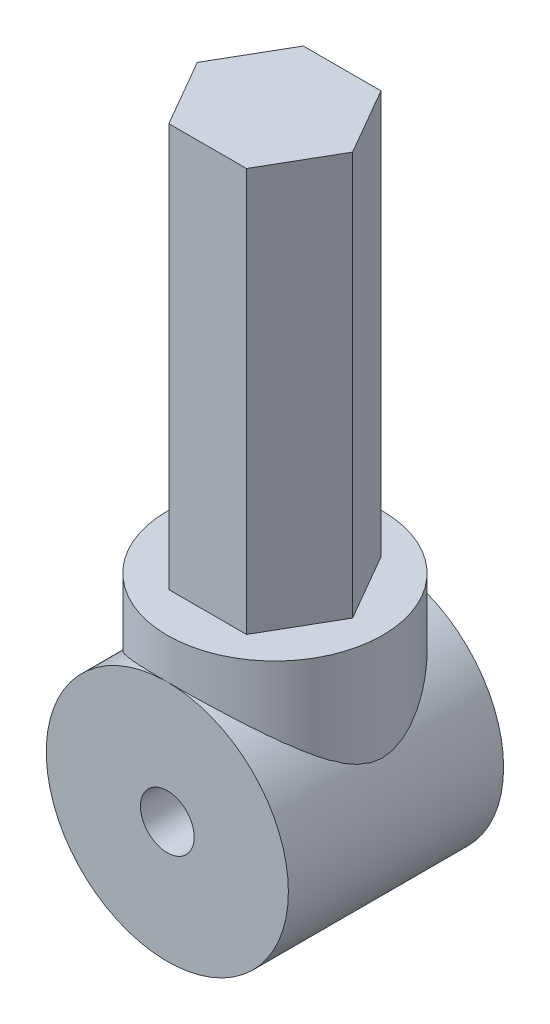
ISO-10303-21;
HEADER;
FILE_DESCRIPTION(('STEP AP214'),'2;1');
FILE_NAME('part.step','',(''),(''),'','','');
FILE_SCHEMA(('AUTOMOTIVE_DESIGN { 1 0 10303 214 1 1 1 1 }'));
ENDSEC;
DATA;
#1=APPLICATION_CONTEXT('core data for automotive mechanical design processes');
#2=APPLICATION_PROTOCOL_DEFINITION('international standard','automotive_design',2000,#1);
#3=PRODUCT_CONTEXT('',#1,'mechanical');
#4=PRODUCT('Part','Part','',(#3));
#5=PRODUCT_RELATED_PRODUCT_CATEGORY('part','',(#4));
#6=PRODUCT_DEFINITION_FORMATION('','',#4);
#7=PRODUCT_DEFINITION_CONTEXT('part definition',#1,'design');
#8=PRODUCT_DEFINITION('design','',#6,#7);
#9=PRODUCT_DEFINITION_SHAPE('','',#8);
#10=(LENGTH_UNIT() NAMED_UNIT(*) SI_UNIT(.MILLI.,.METRE.));
#11=(NAMED_UNIT(*) PLANE_ANGLE_UNIT() SI_UNIT($,.RADIAN.));
#12=(NAMED_UNIT(*) SI_UNIT($,.STERADIAN.) SOLID_ANGLE_UNIT());
#13=UNCERTAINTY_MEASURE_WITH_UNIT(LENGTH_MEASURE(1.E-05),#10,'distance_accuracy_value','');
#14=(GEOMETRIC_REPRESENTATION_CONTEXT(3) GLOBAL_UNCERTAINTY_ASSIGNED_CONTEXT((#13)) GLOBAL_UNIT_ASSIGNED_CONTEXT((#10,
#11,#12)) REPRESENTATION_CONTEXT('',''));
#15=CARTESIAN_POINT('',(0.,0.,0.));
#16=DIRECTION('',(0.,0.,1.));
#17=DIRECTION('',(1.,0.,0.));
#18=AXIS2_PLACEMENT_3D('',#15,#16,#17);
#19=CARTESIAN_POINT('',(0.,30.,20.));
#20=DIRECTION('',(0.,-1.,0.));
#21=DIRECTION('',(0.,0.,-1.));
#22=AXIS2_PLACEMENT_3D('',#19,#20,#21);
#23=CYLINDRICAL_SURFACE('',#22,20.);
#24=CARTESIAN_POINT('',(0.,30.,20.));
#25=DIRECTION('',(0.,1.,0.));
#26=DIRECTION('',(0.,0.,1.));
#27=AXIS2_PLACEMENT_3D('',#24,#25,#26);
#28=CIRCLE('',#27,20.);
#29=CARTESIAN_POINT('',(0.,30.,40.));
#30=VERTEX_POINT('',#29);
#31=EDGE_CURVE('E12',#30,#30,#28,.T.);
#32=ORIENTED_EDGE('',*,*,#31,.F.);
#33=EDGE_LOOP('',(#32));
#34=FACE_BOUND('',#33,.T.);
#35=CARTESIAN_POINT('',(0.,5.,20.));
#36=DIRECTION('',(0.,1.,0.));
#37=DIRECTION('',(0.,0.,1.));
#38=AXIS2_PLACEMENT_3D('',#35,#36,#37);
#39=CIRCLE('',#38,20.);
#40=CARTESIAN_POINT('',(0.,5.,40.));
#41=VERTEX_POINT('',#40);
#42=EDGE_CURVE('E58',#41,#41,#39,.T.);
#43=ORIENTED_EDGE('',*,*,#42,.T.);
#44=EDGE_LOOP('',(#43));
#45=FACE_BOUND('',#44,.T.);
#46=ADVANCED_FACE('F55',(#34,#45),#23,.T.);
#47=CARTESIAN_POINT('',(0.,30.,0.));
#48=DIRECTION('',(0.,1.,0.));
#49=DIRECTION('',(0.,0.,1.));
#50=AXIS2_PLACEMENT_3D('',#47,#48,#49);
#51=PLANE('',#50);
#52=DIRECTION('',(0.5,0.,-0.866025403784439));
#53=VECTOR('',#52,1.);
#54=CARTESIAN_POINT('',(19.4855715851499,30.,11.25));
#55=LINE('',#54,#53);
#56=CARTESIAN_POINT('',(7.21687836487033,30.,32.5));
#57=VERTEX_POINT('',#56);
#58=CARTESIAN_POINT('',(14.4337567297407,30.,20.));
#59=VERTEX_POINT('',#58);
#60=EDGE_CURVE('E70',#57,#59,#55,.T.);
#61=ORIENTED_EDGE('',*,*,#60,.F.);
#62=DIRECTION('',(1.,0.,0.));
#63=VECTOR('',#62,1.);
#64=CARTESIAN_POINT('',(0.,30.,32.5));
#65=LINE('',#64,#63);
#66=CARTESIAN_POINT('',(-7.21687836487032,30.,32.5));
#67=VERTEX_POINT('',#66);
#68=EDGE_CURVE('E74',#67,#57,#65,.T.);
#69=ORIENTED_EDGE('',*,*,#68,.F.);
#70=DIRECTION('',(0.5,0.,0.866025403784439));
#71=VECTOR('',#70,1.);
#72=CARTESIAN_POINT('',(-19.4855715851499,30.,11.25));
#73=LINE('',#72,#71);
#74=CARTESIAN_POINT('',(-14.4337567297407,30.,20.));
#75=VERTEX_POINT('',#74);
#76=EDGE_CURVE('E160',#75,#67,#73,.T.);
#77=ORIENTED_EDGE('',*,*,#76,.F.);
#78=DIRECTION('',(-0.5,0.,0.866025403784439));
#79=VECTOR('',#78,1.);
#80=CARTESIAN_POINT('',(-2.16506350946111,30.,-1.25000000000001));
#81=LINE('',#80,#79);
#82=CARTESIAN_POINT('',(-7.21687836487033,30.,7.49999999999999));
#83=VERTEX_POINT('',#82);
#84=EDGE_CURVE('E156',#83,#75,#81,.T.);
#85=ORIENTED_EDGE('',*,*,#84,.F.);
#86=DIRECTION('',(-1.,0.,0.));
#87=VECTOR('',#86,1.);
#88=CARTESIAN_POINT('',(0.,30.,7.49999999999999));
#89=LINE('',#88,#87);
#90=CARTESIAN_POINT('',(7.21687836487033,30.,7.49999999999999));
#91=VERTEX_POINT('',#90);
#92=EDGE_CURVE('E152',#91,#83,#89,.T.);
#93=ORIENTED_EDGE('',*,*,#92,.F.);
#94=DIRECTION('',(-0.5,0.,-0.866025403784439));
#95=VECTOR('',#94,1.);
#96=CARTESIAN_POINT('',(2.1650635094611,30.,-1.25));
#97=LINE('',#96,#95);
#98=EDGE_CURVE('E148',#59,#91,#97,.T.);
#99=ORIENTED_EDGE('',*,*,#98,.F.);
#100=EDGE_LOOP('',(#61,#69,#77,#85,#93,#99));
#101=FACE_BOUND('',#100,.T.);
#102=ORIENTED_EDGE('',*,*,#31,.T.);
#103=EDGE_LOOP('',(#102));
#104=FACE_BOUND('',#103,.T.);
#105=ADVANCED_FACE('F188',(#101,#104),#51,.T.);
#106=CARTESIAN_POINT('',(0.,5.,0.));
#107=DIRECTION('',(0.,1.,0.));
#108=DIRECTION('',(0.,0.,1.));
#109=AXIS2_PLACEMENT_3D('',#106,#107,#108);
#110=PLANE('',#109);
#111=ORIENTED_EDGE('',*,*,#42,.F.);
#112=EDGE_LOOP('',(#111));
#113=FACE_BOUND('',#112,.T.);
#114=ADVANCED_FACE('F186',(#113),#110,.F.);
#115=CARTESIAN_POINT('',(19.4855715851499,55.,11.25));
#116=DIRECTION('',(-0.866025403784439,0.,-0.5));
#117=DIRECTION('',(-0.5,0.,0.866025403784439));
#118=AXIS2_PLACEMENT_3D('',#115,#116,#117);
#119=PLANE('',#118);
#120=ORIENTED_EDGE('',*,*,#60,.T.);
#121=DIRECTION('',(0.,-1.,0.));
#122=VECTOR('',#121,1.);
#123=CARTESIAN_POINT('',(14.4337567297407,55.,20.));
#124=LINE('',#123,#122);
#125=CARTESIAN_POINT('',(14.4337567297407,105.,20.));
#126=VERTEX_POINT('',#125);
#127=EDGE_CURVE('E120',#126,#59,#124,.T.);
#128=ORIENTED_EDGE('',*,*,#127,.F.);
#129=DIRECTION('',(0.499999999999999,0.,-0.866025403784439));
#130=VECTOR('',#129,1.);
#131=CARTESIAN_POINT('',(7.21687836487033,105.,32.5));
#132=LINE('',#131,#130);
#133=CARTESIAN_POINT('',(7.21687836487033,105.,32.5));
#134=VERTEX_POINT('',#133);
#135=EDGE_CURVE('E117',#134,#126,#132,.T.);
#136=ORIENTED_EDGE('',*,*,#135,.F.);
#137=DIRECTION('',(0.,-1.,0.));
#138=VECTOR('',#137,1.);
#139=CARTESIAN_POINT('',(7.21687836487033,55.,32.5));
#140=LINE('',#139,#138);
#141=EDGE_CURVE('E106',#134,#57,#140,.T.);
#142=ORIENTED_EDGE('',*,*,#141,.T.);
#143=EDGE_LOOP('',(#120,#128,#136,#142));
#144=FACE_BOUND('',#143,.T.);
#145=ADVANCED_FACE('F118',(#144),#119,.F.);
#146=CARTESIAN_POINT('',(2.1650635094611,55.,-1.25));
#147=DIRECTION('',(-0.866025403784439,0.,0.5));
#148=DIRECTION('',(0.5,0.,0.866025403784439));
#149=AXIS2_PLACEMENT_3D('',#146,#147,#148);
#150=PLANE('',#149);
#151=ORIENTED_EDGE('',*,*,#98,.T.);
#152=DIRECTION('',(0.,-1.,0.));
#153=VECTOR('',#152,1.);
#154=CARTESIAN_POINT('',(7.21687836487033,55.,7.49999999999999));
#155=LINE('',#154,#153);
#156=CARTESIAN_POINT('',(7.21687836487027,105.,7.49999999999996));
#157=VERTEX_POINT('',#156);
#158=EDGE_CURVE('E175',#157,#91,#155,.T.);
#159=ORIENTED_EDGE('',*,*,#158,.F.);
#160=DIRECTION('',(-0.500000000000003,0.,-0.866025403784437));
#161=VECTOR('',#160,1.);
#162=CARTESIAN_POINT('',(14.4337567297407,105.,20.));
#163=LINE('',#162,#161);
#164=EDGE_CURVE('E125',#126,#157,#163,.T.);
#165=ORIENTED_EDGE('',*,*,#164,.F.);
#166=ORIENTED_EDGE('',*,*,#127,.T.);
#167=EDGE_LOOP('',(#151,#159,#165,#166));
#168=FACE_BOUND('',#167,.T.);
#169=ADVANCED_FACE('F193',(#168),#150,.F.);
#170=CARTESIAN_POINT('',(0.,55.,7.49999999999999));
#171=DIRECTION('',(0.,0.,1.));
#172=DIRECTION('',(1.,0.,0.));
#173=AXIS2_PLACEMENT_3D('',#170,#171,#172);
#174=PLANE('',#173);
#175=ORIENTED_EDGE('',*,*,#92,.T.);
#176=DIRECTION('',(0.,-1.,0.));
#177=VECTOR('',#176,1.);
#178=CARTESIAN_POINT('',(-7.21687836487033,55.,7.49999999999999));
#179=LINE('',#178,#177);
#180=CARTESIAN_POINT('',(-7.21687836487042,105.,7.50000000000004));
#181=VERTEX_POINT('',#180);
#182=EDGE_CURVE('E171',#181,#83,#179,.T.);
#183=ORIENTED_EDGE('',*,*,#182,.F.);
#184=DIRECTION('',(-1.,0.,0.));
#185=VECTOR('',#184,1.);
#186=CARTESIAN_POINT('',(7.21687836487027,105.,7.49999999999996));
#187=LINE('',#186,#185);
#188=EDGE_CURVE('E137',#157,#181,#187,.T.);
#189=ORIENTED_EDGE('',*,*,#188,.F.);
#190=ORIENTED_EDGE('',*,*,#158,.T.);
#191=EDGE_LOOP('',(#175,#183,#189,#190));
#192=FACE_BOUND('',#191,.T.);
#193=ADVANCED_FACE('F226',(#192),#174,.F.);
#194=CARTESIAN_POINT('',(-2.16506350946111,55.,-1.25000000000001));
#195=DIRECTION('',(0.866025403784439,0.,0.5));
#196=DIRECTION('',(0.5,0.,-0.866025403784439));
#197=AXIS2_PLACEMENT_3D('',#194,#195,#196);
#198=PLANE('',#197);
#199=ORIENTED_EDGE('',*,*,#84,.T.);
#200=DIRECTION('',(0.,-1.,0.));
#201=VECTOR('',#200,1.);
#202=CARTESIAN_POINT('',(-14.4337567297407,55.,20.));
#203=LINE('',#202,#201);
#204=CARTESIAN_POINT('',(-14.4337567297407,105.,20.0000000000001));
#205=VERTEX_POINT('',#204);
#206=EDGE_CURVE('E167',#205,#75,#203,.T.);
#207=ORIENTED_EDGE('',*,*,#206,.F.);
#208=DIRECTION('',(-0.499999999999993,0.,0.866025403784443));
#209=VECTOR('',#208,1.);
#210=CARTESIAN_POINT('',(-7.21687836487042,105.,7.50000000000004));
#211=LINE('',#210,#209);
#212=EDGE_CURVE('E141',#181,#205,#211,.T.);
#213=ORIENTED_EDGE('',*,*,#212,.F.);
#214=ORIENTED_EDGE('',*,*,#182,.T.);
#215=EDGE_LOOP('',(#199,#207,#213,#214));
#216=FACE_BOUND('',#215,.T.);
#217=ADVANCED_FACE('F236',(#216),#198,.F.);
#218=CARTESIAN_POINT('',(-19.4855715851499,55.,11.25));
#219=DIRECTION('',(0.866025403784439,0.,-0.5));
#220=DIRECTION('',(-0.5,0.,-0.866025403784439));
#221=AXIS2_PLACEMENT_3D('',#218,#219,#220);
#222=PLANE('',#221);
#223=ORIENTED_EDGE('',*,*,#76,.T.);
#224=DIRECTION('',(0.,-1.,0.));
#225=VECTOR('',#224,1.);
#226=CARTESIAN_POINT('',(-7.21687836487032,55.,32.5));
#227=LINE('',#226,#225);
#228=CARTESIAN_POINT('',(-7.21687836487018,105.,32.5000000000001));
#229=VERTEX_POINT('',#228);
#230=EDGE_CURVE('E114',#229,#67,#227,.T.);
#231=ORIENTED_EDGE('',*,*,#230,.F.);
#232=DIRECTION('',(0.500000000000009,0.,0.866025403784433));
#233=VECTOR('',#232,1.);
#234=CARTESIAN_POINT('',(-14.4337567297407,105.,20.0000000000001));
#235=LINE('',#234,#233);
#236=EDGE_CURVE('E131',#205,#229,#235,.T.);
#237=ORIENTED_EDGE('',*,*,#236,.F.);
#238=ORIENTED_EDGE('',*,*,#206,.T.);
#239=EDGE_LOOP('',(#223,#231,#237,#238));
#240=FACE_BOUND('',#239,.T.);
#241=ADVANCED_FACE('F247',(#240),#222,.F.);
#242=CARTESIAN_POINT('',(0.,55.,32.5));
#243=DIRECTION('',(0.,0.,-1.));
#244=DIRECTION('',(-1.,0.,0.));
#245=AXIS2_PLACEMENT_3D('',#242,#243,#244);
#246=PLANE('',#245);
#247=ORIENTED_EDGE('',*,*,#68,.T.);
#248=ORIENTED_EDGE('',*,*,#141,.F.);
#249=DIRECTION('',(1.,0.,0.));
#250=VECTOR('',#249,1.);
#251=CARTESIAN_POINT('',(-7.21687836487018,105.,32.5000000000001));
#252=LINE('',#251,#250);
#253=EDGE_CURVE('E111',#229,#134,#252,.T.);
#254=ORIENTED_EDGE('',*,*,#253,.F.);
#255=ORIENTED_EDGE('',*,*,#230,.T.);
#256=EDGE_LOOP('',(#247,#248,#254,#255));
#257=FACE_BOUND('',#256,.T.);
#258=ADVANCED_FACE('F108',(#257),#246,.F.);
#259=CARTESIAN_POINT('',(0.,105.,0.));
#260=DIRECTION('',(0.,1.,0.));
#261=DIRECTION('',(0.,0.,1.));
#262=AXIS2_PLACEMENT_3D('',#259,#260,#261);
#263=PLANE('',#262);
#264=ORIENTED_EDGE('',*,*,#253,.T.);
#265=ORIENTED_EDGE('',*,*,#135,.T.);
#266=ORIENTED_EDGE('',*,*,#164,.T.);
#267=ORIENTED_EDGE('',*,*,#188,.T.);
#268=ORIENTED_EDGE('',*,*,#212,.T.);
#269=ORIENTED_EDGE('',*,*,#236,.T.);
#270=EDGE_LOOP('',(#264,#265,#266,#267,#268,#269));
#271=FACE_BOUND('',#270,.T.);
#272=ADVANCED_FACE('F128',(#271),#263,.T.);
#273=CLOSED_SHELL('',(#46,#105,#114,#145,#169,#193,#217,#241,#258,#272));
#274=MANIFOLD_SOLID_BREP('B2',#273);
#275=CARTESIAN_POINT('',(0.,0.,40.));
#276=DIRECTION('',(0.,0.,1.));
#277=DIRECTION('',(1.,0.,0.));
#278=AXIS2_PLACEMENT_3D('',#275,#276,#277);
#279=PLANE('',#278);
#280=CARTESIAN_POINT('',(0.,0.,40.));
#281=DIRECTION('',(0.,0.,1.));
#282=DIRECTION('',(1.,0.,0.));
#283=AXIS2_PLACEMENT_3D('',#280,#281,#282);
#284=CIRCLE('',#283,22.5);
#285=CARTESIAN_POINT('',(22.5,0.,40.));
#286=VERTEX_POINT('',#285);
#287=EDGE_CURVE('E54',#286,#286,#284,.T.);
#288=ORIENTED_EDGE('',*,*,#287,.T.);
#289=EDGE_LOOP('',(#288));
#290=FACE_BOUND('',#289,.T.);
#291=CARTESIAN_POINT('',(0.,0.,40.));
#292=DIRECTION('',(0.,0.,1.));
#293=DIRECTION('',(1.,0.,0.));
#294=AXIS2_PLACEMENT_3D('',#291,#292,#293);
#295=CIRCLE('',#294,5.);
#296=CARTESIAN_POINT('',(5.,0.,40.));
#297=VERTEX_POINT('',#296);
#298=EDGE_CURVE('E329',#297,#297,#295,.T.);
#299=ORIENTED_EDGE('',*,*,#298,.F.);
#300=EDGE_LOOP('',(#299));
#301=FACE_BOUND('',#300,.T.);
#302=ADVANCED_FACE('F318',(#290,#301),#279,.T.);
#303=CARTESIAN_POINT('',(0.,0.,0.));
#304=DIRECTION('',(0.,0.,1.));
#305=DIRECTION('',(1.,0.,0.));
#306=AXIS2_PLACEMENT_3D('',#303,#304,#305);
#307=PLANE('',#306);
#308=CARTESIAN_POINT('',(0.,0.,0.));
#309=DIRECTION('',(0.,0.,1.));
#310=DIRECTION('',(1.,0.,0.));
#311=AXIS2_PLACEMENT_3D('',#308,#309,#310);
#312=CIRCLE('',#311,22.5);
#313=CARTESIAN_POINT('',(22.5,0.,0.));
#314=VERTEX_POINT('',#313);
#315=EDGE_CURVE('E322',#314,#314,#312,.T.);
#316=ORIENTED_EDGE('',*,*,#315,.F.);
#317=EDGE_LOOP('',(#316));
#318=FACE_BOUND('',#317,.T.);
#319=CARTESIAN_POINT('',(0.,0.,0.));
#320=DIRECTION('',(0.,0.,1.));
#321=DIRECTION('',(1.,0.,0.));
#322=AXIS2_PLACEMENT_3D('',#319,#320,#321);
#323=CIRCLE('',#322,5.);
#324=CARTESIAN_POINT('',(5.,0.,0.));
#325=VERTEX_POINT('',#324);
#326=EDGE_CURVE('E331',#325,#325,#323,.T.);
#327=ORIENTED_EDGE('',*,*,#326,.T.);
#328=EDGE_LOOP('',(#327));
#329=FACE_BOUND('',#328,.T.);
#330=ADVANCED_FACE('F341',(#318,#329),#307,.F.);
#331=CARTESIAN_POINT('',(0.,0.,40.));
#332=DIRECTION('',(0.,0.,-1.));
#333=DIRECTION('',(-1.,0.,0.));
#334=AXIS2_PLACEMENT_3D('',#331,#332,#333);
#335=CYLINDRICAL_SURFACE('',#334,22.5);
#336=ORIENTED_EDGE('',*,*,#287,.F.);
#337=EDGE_LOOP('',(#336));
#338=FACE_BOUND('',#337,.T.);
#339=ORIENTED_EDGE('',*,*,#315,.T.);
#340=EDGE_LOOP('',(#339));
#341=FACE_BOUND('',#340,.T.);
#342=ADVANCED_FACE('F320',(#338,#341),#335,.T.);
#343=CARTESIAN_POINT('',(0.,0.,40.));
#344=DIRECTION('',(0.,0.,-1.));
#345=DIRECTION('',(-1.,0.,0.));
#346=AXIS2_PLACEMENT_3D('',#343,#344,#345);
#347=CYLINDRICAL_SURFACE('',#346,5.);
#348=ORIENTED_EDGE('',*,*,#298,.T.);
#349=EDGE_LOOP('',(#348));
#350=FACE_BOUND('',#349,.T.);
#351=ORIENTED_EDGE('',*,*,#326,.F.);
#352=EDGE_LOOP('',(#351));
#353=FACE_BOUND('',#352,.T.);
#354=ADVANCED_FACE('F337',(#350,#353),#347,.F.);
#355=CLOSED_SHELL('',(#302,#330,#342,#354));
#356=MANIFOLD_SOLID_BREP('B6',#355);
#357=ADVANCED_BREP_SHAPE_REPRESENTATION('',(#18,#274,#356),#14);
#358=SHAPE_DEFINITION_REPRESENTATION(#9,#357);
ENDSEC;
END-ISO-10303-21;
